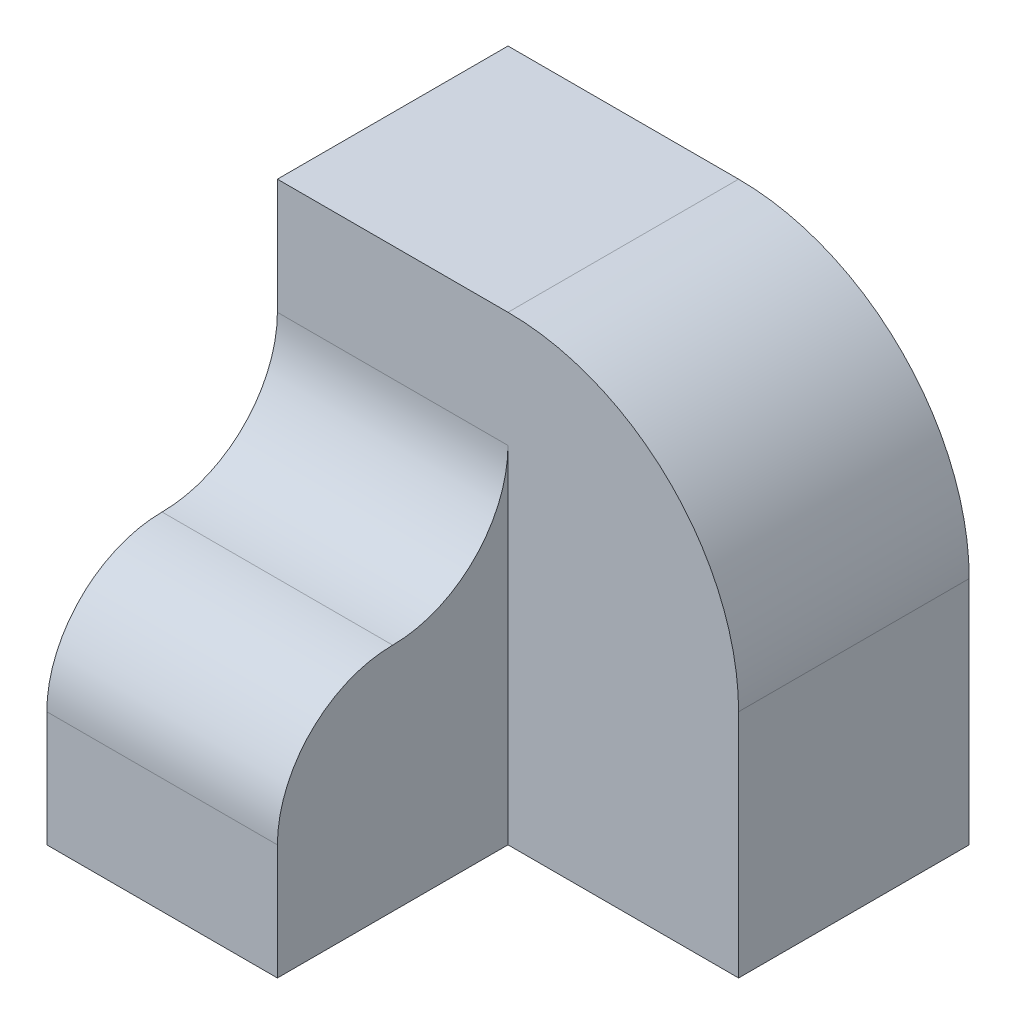
ISO-10303-21;
HEADER;
FILE_DESCRIPTION(('STEP AP214'),'2;1');
FILE_NAME('part.step','',(''),(''),'','','');
FILE_SCHEMA(('AUTOMOTIVE_DESIGN { 1 0 10303 214 1 1 1 1 }'));
ENDSEC;
DATA;
#1=APPLICATION_CONTEXT('core data for automotive mechanical design processes');
#2=APPLICATION_PROTOCOL_DEFINITION('international standard','automotive_design',2000,#1);
#3=PRODUCT_CONTEXT('',#1,'mechanical');
#4=PRODUCT('Part','Part','',(#3));
#5=PRODUCT_RELATED_PRODUCT_CATEGORY('part','',(#4));
#6=PRODUCT_DEFINITION_FORMATION('','',#4);
#7=PRODUCT_DEFINITION_CONTEXT('part definition',#1,'design');
#8=PRODUCT_DEFINITION('design','',#6,#7);
#9=PRODUCT_DEFINITION_SHAPE('','',#8);
#10=(LENGTH_UNIT() NAMED_UNIT(*) SI_UNIT(.MILLI.,.METRE.));
#11=(NAMED_UNIT(*) PLANE_ANGLE_UNIT() SI_UNIT($,.RADIAN.));
#12=(NAMED_UNIT(*) SI_UNIT($,.STERADIAN.) SOLID_ANGLE_UNIT());
#13=UNCERTAINTY_MEASURE_WITH_UNIT(LENGTH_MEASURE(1.E-05),#10,'distance_accuracy_value','');
#14=(GEOMETRIC_REPRESENTATION_CONTEXT(3) GLOBAL_UNCERTAINTY_ASSIGNED_CONTEXT((#13)) GLOBAL_UNIT_ASSIGNED_CONTEXT((#10,
#11,#12)) REPRESENTATION_CONTEXT('',''));
#15=CARTESIAN_POINT('',(0.,0.,0.));
#16=DIRECTION('',(0.,0.,1.));
#17=DIRECTION('',(1.,0.,0.));
#18=AXIS2_PLACEMENT_3D('',#15,#16,#17);
#19=CARTESIAN_POINT('',(0.,40.,20.));
#20=DIRECTION('',(1.,0.,0.));
#21=DIRECTION('',(0.,1.,0.));
#22=AXIS2_PLACEMENT_3D('',#19,#20,#21);
#23=PLANE('',#22);
#24=DIRECTION('',(0.,-1.,0.));
#25=VECTOR('',#24,1.);
#26=CARTESIAN_POINT('',(0.,40.,40.));
#27=LINE('',#26,#25);
#28=CARTESIAN_POINT('',(0.,10.,40.));
#29=VERTEX_POINT('',#28);
#30=CARTESIAN_POINT('',(0.,0.,40.));
#31=VERTEX_POINT('',#30);
#32=EDGE_CURVE('E186',#29,#31,#27,.T.);
#33=ORIENTED_EDGE('',*,*,#32,.F.);
#34=CARTESIAN_POINT('',(0.,10.,30.));
#35=DIRECTION('',(1.,0.,0.));
#36=DIRECTION('',(0.,1.,0.));
#37=AXIS2_PLACEMENT_3D('',#34,#35,#36);
#38=CIRCLE('',#37,10.);
#39=CARTESIAN_POINT('',(0.,20.,30.));
#40=VERTEX_POINT('',#39);
#41=EDGE_CURVE('E11',#29,#40,#38,.F.);
#42=ORIENTED_EDGE('',*,*,#41,.T.);
#43=CARTESIAN_POINT('',(0.,30.,30.));
#44=DIRECTION('',(1.,0.,0.));
#45=DIRECTION('',(0.,1.,0.));
#46=AXIS2_PLACEMENT_3D('',#43,#44,#45);
#47=CIRCLE('',#46,10.);
#48=CARTESIAN_POINT('',(0.,30.,20.));
#49=VERTEX_POINT('',#48);
#50=EDGE_CURVE('E119',#40,#49,#47,.T.);
#51=ORIENTED_EDGE('',*,*,#50,.T.);
#52=DIRECTION('',(0.,1.,0.));
#53=VECTOR('',#52,1.);
#54=CARTESIAN_POINT('',(0.,0.,20.));
#55=LINE('',#54,#53);
#56=CARTESIAN_POINT('',(0.,40.,20.));
#57=VERTEX_POINT('',#56);
#58=EDGE_CURVE('E112',#49,#57,#55,.T.);
#59=ORIENTED_EDGE('',*,*,#58,.T.);
#60=DIRECTION('',(0.,0.,-1.));
#61=VECTOR('',#60,1.);
#62=CARTESIAN_POINT('',(0.,40.,20.));
#63=LINE('',#62,#61);
#64=CARTESIAN_POINT('',(0.,40.,0.));
#65=VERTEX_POINT('',#64);
#66=EDGE_CURVE('E116',#57,#65,#63,.T.);
#67=ORIENTED_EDGE('',*,*,#66,.T.);
#68=DIRECTION('',(0.,-1.,0.));
#69=VECTOR('',#68,1.);
#70=CARTESIAN_POINT('',(0.,40.,0.));
#71=LINE('',#70,#69);
#72=CARTESIAN_POINT('',(0.,0.,0.));
#73=VERTEX_POINT('',#72);
#74=EDGE_CURVE('E202',#65,#73,#71,.T.);
#75=ORIENTED_EDGE('',*,*,#74,.T.);
#76=DIRECTION('',(0.,0.,-1.));
#77=VECTOR('',#76,1.);
#78=CARTESIAN_POINT('',(0.,0.,20.));
#79=LINE('',#78,#77);
#80=EDGE_CURVE('E159',#31,#73,#79,.T.);
#81=ORIENTED_EDGE('',*,*,#80,.F.);
#82=EDGE_LOOP('',(#33,#42,#51,#59,#67,#75,#81));
#83=FACE_BOUND('',#82,.T.);
#84=ADVANCED_FACE('F42',(#83),#23,.F.);
#85=CARTESIAN_POINT('',(0.,0.,20.));
#86=DIRECTION('',(0.,1.,0.));
#87=DIRECTION('',(0.,0.,1.));
#88=AXIS2_PLACEMENT_3D('',#85,#86,#87);
#89=PLANE('',#88);
#90=DIRECTION('',(1.,0.,0.));
#91=VECTOR('',#90,1.);
#92=CARTESIAN_POINT('',(0.,0.,0.));
#93=LINE('',#92,#91);
#94=CARTESIAN_POINT('',(40.,0.,0.));
#95=VERTEX_POINT('',#94);
#96=EDGE_CURVE('E210',#73,#95,#93,.T.);
#97=ORIENTED_EDGE('',*,*,#96,.T.);
#98=DIRECTION('',(0.,0.,-1.));
#99=VECTOR('',#98,1.);
#100=CARTESIAN_POINT('',(40.,0.,20.));
#101=LINE('',#100,#99);
#102=CARTESIAN_POINT('',(40.,0.,20.));
#103=VERTEX_POINT('',#102);
#104=EDGE_CURVE('E155',#103,#95,#101,.T.);
#105=ORIENTED_EDGE('',*,*,#104,.F.);
#106=DIRECTION('',(1.,0.,0.));
#107=VECTOR('',#106,1.);
#108=CARTESIAN_POINT('',(0.,0.,20.));
#109=LINE('',#108,#107);
#110=CARTESIAN_POINT('',(20.,0.,20.));
#111=VERTEX_POINT('',#110);
#112=EDGE_CURVE('E203',#111,#103,#109,.T.);
#113=ORIENTED_EDGE('',*,*,#112,.F.);
#114=DIRECTION('',(0.,0.,-1.));
#115=VECTOR('',#114,1.);
#116=CARTESIAN_POINT('',(20.,0.,40.));
#117=LINE('',#116,#115);
#118=CARTESIAN_POINT('',(20.,0.,40.));
#119=VERTEX_POINT('',#118);
#120=EDGE_CURVE('E198',#119,#111,#117,.T.);
#121=ORIENTED_EDGE('',*,*,#120,.F.);
#122=DIRECTION('',(1.,0.,0.));
#123=VECTOR('',#122,1.);
#124=CARTESIAN_POINT('',(0.,0.,40.));
#125=LINE('',#124,#123);
#126=EDGE_CURVE('E189',#31,#119,#125,.T.);
#127=ORIENTED_EDGE('',*,*,#126,.F.);
#128=ORIENTED_EDGE('',*,*,#80,.T.);
#129=EDGE_LOOP('',(#97,#105,#113,#121,#127,#128));
#130=FACE_BOUND('',#129,.T.);
#131=ADVANCED_FACE('F227',(#130),#89,.F.);
#132=CARTESIAN_POINT('',(40.,0.,20.));
#133=DIRECTION('',(-1.,0.,0.));
#134=DIRECTION('',(0.,-1.,0.));
#135=AXIS2_PLACEMENT_3D('',#132,#133,#134);
#136=PLANE('',#135);
#137=DIRECTION('',(0.,1.,0.));
#138=VECTOR('',#137,1.);
#139=CARTESIAN_POINT('',(40.,0.,0.));
#140=LINE('',#139,#138);
#141=CARTESIAN_POINT('',(40.,20.,0.));
#142=VERTEX_POINT('',#141);
#143=EDGE_CURVE('E213',#95,#142,#140,.T.);
#144=ORIENTED_EDGE('',*,*,#143,.T.);
#145=DIRECTION('',(0.,0.,-1.));
#146=VECTOR('',#145,1.);
#147=CARTESIAN_POINT('',(40.,20.,20.));
#148=LINE('',#147,#146);
#149=CARTESIAN_POINT('',(40.,20.,20.));
#150=VERTEX_POINT('',#149);
#151=EDGE_CURVE('E145',#150,#142,#148,.T.);
#152=ORIENTED_EDGE('',*,*,#151,.F.);
#153=DIRECTION('',(0.,1.,0.));
#154=VECTOR('',#153,1.);
#155=CARTESIAN_POINT('',(40.,0.,20.));
#156=LINE('',#155,#154);
#157=EDGE_CURVE('E147',#103,#150,#156,.T.);
#158=ORIENTED_EDGE('',*,*,#157,.F.);
#159=ORIENTED_EDGE('',*,*,#104,.T.);
#160=EDGE_LOOP('',(#144,#152,#158,#159));
#161=FACE_BOUND('',#160,.T.);
#162=ADVANCED_FACE('F245',(#161),#136,.F.);
#163=CARTESIAN_POINT('',(20.,20.,20.));
#164=DIRECTION('',(0.,0.,-1.));
#165=DIRECTION('',(-1.,0.,0.));
#166=AXIS2_PLACEMENT_3D('',#163,#164,#165);
#167=CYLINDRICAL_SURFACE('',#166,20.);
#168=CARTESIAN_POINT('',(20.,20.,0.));
#169=DIRECTION('',(0.,0.,1.));
#170=DIRECTION('',(1.,0.,0.));
#171=AXIS2_PLACEMENT_3D('',#168,#169,#170);
#172=CIRCLE('',#171,20.);
#173=CARTESIAN_POINT('',(20.,40.,0.));
#174=VERTEX_POINT('',#173);
#175=EDGE_CURVE('E215',#142,#174,#172,.T.);
#176=ORIENTED_EDGE('',*,*,#175,.T.);
#177=DIRECTION('',(0.,0.,-1.));
#178=VECTOR('',#177,1.);
#179=CARTESIAN_POINT('',(20.,40.,20.));
#180=LINE('',#179,#178);
#181=CARTESIAN_POINT('',(20.,40.,20.));
#182=VERTEX_POINT('',#181);
#183=EDGE_CURVE('E141',#182,#174,#180,.T.);
#184=ORIENTED_EDGE('',*,*,#183,.F.);
#185=CARTESIAN_POINT('',(20.,20.,20.));
#186=DIRECTION('',(0.,0.,1.));
#187=DIRECTION('',(1.,0.,0.));
#188=AXIS2_PLACEMENT_3D('',#185,#186,#187);
#189=CIRCLE('',#188,20.);
#190=EDGE_CURVE('E129',#150,#182,#189,.T.);
#191=ORIENTED_EDGE('',*,*,#190,.F.);
#192=ORIENTED_EDGE('',*,*,#151,.T.);
#193=EDGE_LOOP('',(#176,#184,#191,#192));
#194=FACE_BOUND('',#193,.T.);
#195=ADVANCED_FACE('F220',(#194),#167,.T.);
#196=CARTESIAN_POINT('',(20.,40.,20.));
#197=DIRECTION('',(0.,-1.,0.));
#198=DIRECTION('',(1.,0.,0.));
#199=AXIS2_PLACEMENT_3D('',#196,#197,#198);
#200=PLANE('',#199);
#201=ORIENTED_EDGE('',*,*,#66,.F.);
#202=DIRECTION('',(1.,0.,0.));
#203=VECTOR('',#202,1.);
#204=CARTESIAN_POINT('',(0.,40.,20.));
#205=LINE('',#204,#203);
#206=EDGE_CURVE('E124',#57,#182,#205,.T.);
#207=ORIENTED_EDGE('',*,*,#206,.T.);
#208=ORIENTED_EDGE('',*,*,#183,.T.);
#209=DIRECTION('',(-1.,0.,0.));
#210=VECTOR('',#209,1.);
#211=CARTESIAN_POINT('',(20.,40.,0.));
#212=LINE('',#211,#210);
#213=EDGE_CURVE('E138',#174,#65,#212,.T.);
#214=ORIENTED_EDGE('',*,*,#213,.T.);
#215=EDGE_LOOP('',(#201,#207,#208,#214));
#216=FACE_BOUND('',#215,.T.);
#217=ADVANCED_FACE('F136',(#216),#200,.F.);
#218=CARTESIAN_POINT('',(20.,20.,20.));
#219=DIRECTION('',(0.,0.,1.));
#220=DIRECTION('',(1.,0.,0.));
#221=AXIS2_PLACEMENT_3D('',#218,#219,#220);
#222=PLANE('',#221);
#223=ORIENTED_EDGE('',*,*,#58,.F.);
#224=DIRECTION('',(1.,0.,0.));
#225=VECTOR('',#224,1.);
#226=CARTESIAN_POINT('',(20.,30.,20.));
#227=LINE('',#226,#225);
#228=CARTESIAN_POINT('',(20.,30.,20.));
#229=VERTEX_POINT('',#228);
#230=EDGE_CURVE('E163',#49,#229,#227,.T.);
#231=ORIENTED_EDGE('',*,*,#230,.T.);
#232=DIRECTION('',(0.,1.,0.));
#233=VECTOR('',#232,1.);
#234=CARTESIAN_POINT('',(20.,0.,20.));
#235=LINE('',#234,#233);
#236=EDGE_CURVE('E134',#111,#229,#235,.T.);
#237=ORIENTED_EDGE('',*,*,#236,.F.);
#238=ORIENTED_EDGE('',*,*,#112,.T.);
#239=ORIENTED_EDGE('',*,*,#157,.T.);
#240=ORIENTED_EDGE('',*,*,#190,.T.);
#241=ORIENTED_EDGE('',*,*,#206,.F.);
#242=EDGE_LOOP('',(#223,#231,#237,#238,#239,#240,#241));
#243=FACE_BOUND('',#242,.T.);
#244=ADVANCED_FACE('F127',(#243),#222,.T.);
#245=CARTESIAN_POINT('',(20.,20.,0.));
#246=DIRECTION('',(0.,0.,1.));
#247=DIRECTION('',(1.,0.,0.));
#248=AXIS2_PLACEMENT_3D('',#245,#246,#247);
#249=PLANE('',#248);
#250=ORIENTED_EDGE('',*,*,#74,.F.);
#251=ORIENTED_EDGE('',*,*,#213,.F.);
#252=ORIENTED_EDGE('',*,*,#175,.F.);
#253=ORIENTED_EDGE('',*,*,#143,.F.);
#254=ORIENTED_EDGE('',*,*,#96,.F.);
#255=EDGE_LOOP('',(#250,#251,#252,#253,#254));
#256=FACE_BOUND('',#255,.T.);
#257=ADVANCED_FACE('F224',(#256),#249,.F.);
#258=CARTESIAN_POINT('',(20.,0.,40.));
#259=DIRECTION('',(-1.,0.,0.));
#260=DIRECTION('',(0.,-1.,0.));
#261=AXIS2_PLACEMENT_3D('',#258,#259,#260);
#262=PLANE('',#261);
#263=CARTESIAN_POINT('',(20.,30.,30.));
#264=DIRECTION('',(-1.,0.,0.));
#265=DIRECTION('',(0.,-1.,0.));
#266=AXIS2_PLACEMENT_3D('',#263,#264,#265);
#267=CIRCLE('',#266,10.);
#268=CARTESIAN_POINT('',(20.,20.,30.));
#269=VERTEX_POINT('',#268);
#270=EDGE_CURVE('E170',#229,#269,#267,.T.);
#271=ORIENTED_EDGE('',*,*,#270,.T.);
#272=CARTESIAN_POINT('',(20.,10.,30.));
#273=DIRECTION('',(-1.,0.,0.));
#274=DIRECTION('',(0.,-1.,0.));
#275=AXIS2_PLACEMENT_3D('',#272,#273,#274);
#276=CIRCLE('',#275,10.);
#277=CARTESIAN_POINT('',(20.,10.,40.));
#278=VERTEX_POINT('',#277);
#279=EDGE_CURVE('E65',#269,#278,#276,.F.);
#280=ORIENTED_EDGE('',*,*,#279,.T.);
#281=DIRECTION('',(0.,1.,0.));
#282=VECTOR('',#281,1.);
#283=CARTESIAN_POINT('',(20.,0.,40.));
#284=LINE('',#283,#282);
#285=EDGE_CURVE('E193',#119,#278,#284,.T.);
#286=ORIENTED_EDGE('',*,*,#285,.F.);
#287=ORIENTED_EDGE('',*,*,#120,.T.);
#288=ORIENTED_EDGE('',*,*,#236,.T.);
#289=EDGE_LOOP('',(#271,#280,#286,#287,#288));
#290=FACE_BOUND('',#289,.T.);
#291=ADVANCED_FACE('F179',(#290),#262,.F.);
#292=CARTESIAN_POINT('',(0.,0.,40.));
#293=DIRECTION('',(0.,0.,1.));
#294=DIRECTION('',(1.,0.,0.));
#295=AXIS2_PLACEMENT_3D('',#292,#293,#294);
#296=PLANE('',#295);
#297=ORIENTED_EDGE('',*,*,#285,.T.);
#298=DIRECTION('',(1.,0.,0.));
#299=VECTOR('',#298,1.);
#300=CARTESIAN_POINT('',(0.,10.,40.));
#301=LINE('',#300,#299);
#302=EDGE_CURVE('E51',#278,#29,#301,.F.);
#303=ORIENTED_EDGE('',*,*,#302,.T.);
#304=ORIENTED_EDGE('',*,*,#32,.T.);
#305=ORIENTED_EDGE('',*,*,#126,.T.);
#306=EDGE_LOOP('',(#297,#303,#304,#305));
#307=FACE_BOUND('',#306,.T.);
#308=ADVANCED_FACE('F230',(#307),#296,.T.);
#309=CARTESIAN_POINT('',(20.,30.,30.));
#310=DIRECTION('',(1.,0.,0.));
#311=DIRECTION('',(0.,1.,0.));
#312=AXIS2_PLACEMENT_3D('',#309,#310,#311);
#313=CYLINDRICAL_SURFACE('',#312,10.);
#314=ORIENTED_EDGE('',*,*,#50,.F.);
#315=DIRECTION('',(1.,0.,0.));
#316=VECTOR('',#315,1.);
#317=CARTESIAN_POINT('',(0.,20.,30.));
#318=LINE('',#317,#316);
#319=EDGE_CURVE('E166',#269,#40,#318,.F.);
#320=ORIENTED_EDGE('',*,*,#319,.F.);
#321=ORIENTED_EDGE('',*,*,#270,.F.);
#322=ORIENTED_EDGE('',*,*,#230,.F.);
#323=EDGE_LOOP('',(#314,#320,#321,#322));
#324=FACE_BOUND('',#323,.T.);
#325=ADVANCED_FACE('F182',(#324),#313,.F.);
#326=CARTESIAN_POINT('',(0.,10.,30.));
#327=DIRECTION('',(-1.,0.,0.));
#328=DIRECTION('',(0.,-1.,0.));
#329=AXIS2_PLACEMENT_3D('',#326,#327,#328);
#330=CYLINDRICAL_SURFACE('',#329,10.);
#331=ORIENTED_EDGE('',*,*,#41,.F.);
#332=ORIENTED_EDGE('',*,*,#302,.F.);
#333=ORIENTED_EDGE('',*,*,#279,.F.);
#334=ORIENTED_EDGE('',*,*,#319,.T.);
#335=EDGE_LOOP('',(#331,#332,#333,#334));
#336=FACE_BOUND('',#335,.T.);
#337=ADVANCED_FACE('F44',(#336),#330,.T.);
#338=CLOSED_SHELL('',(#84,#131,#162,#195,#217,#244,#257,#291,#308,#325,#337));
#339=MANIFOLD_SOLID_BREP('B2',#338);
#340=ADVANCED_BREP_SHAPE_REPRESENTATION('',(#18,#339),#14);
#341=SHAPE_DEFINITION_REPRESENTATION(#9,#340);
ENDSEC;
END-ISO-10303-21;
